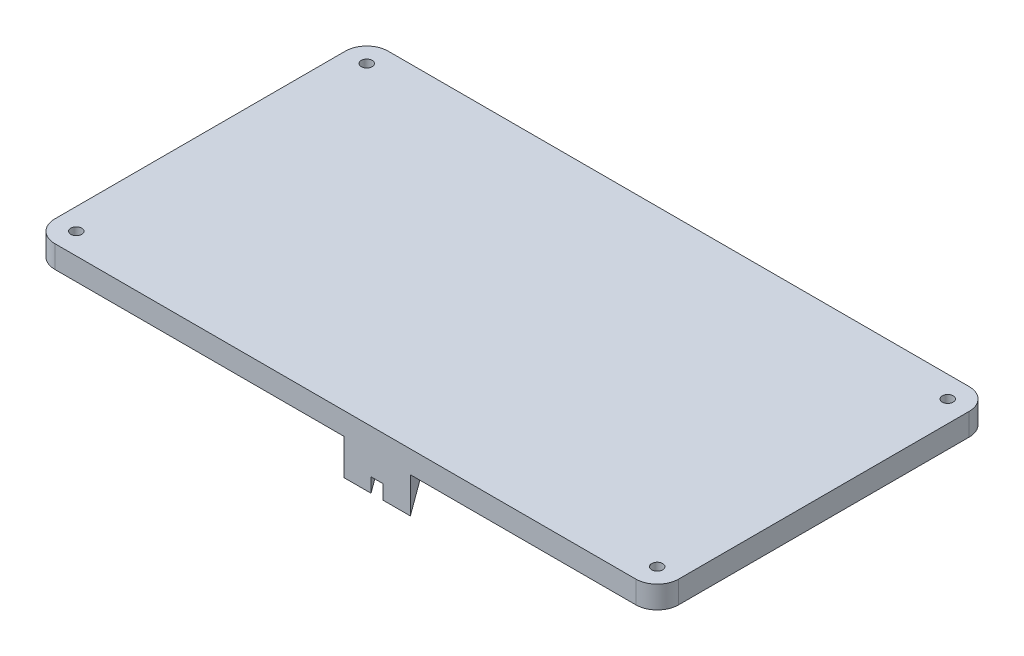
ISO-10303-21;
HEADER;
FILE_DESCRIPTION(('STEP AP214'),'2;1');
FILE_NAME('part.step','',(''),(''),'','','');
FILE_SCHEMA(('AUTOMOTIVE_DESIGN { 1 0 10303 214 1 1 1 1 }'));
ENDSEC;
DATA;
#1=APPLICATION_CONTEXT('core data for automotive mechanical design processes');
#2=APPLICATION_PROTOCOL_DEFINITION('international standard','automotive_design',2000,#1);
#3=PRODUCT_CONTEXT('',#1,'mechanical');
#4=PRODUCT('Part','Part','',(#3));
#5=PRODUCT_RELATED_PRODUCT_CATEGORY('part','',(#4));
#6=PRODUCT_DEFINITION_FORMATION('','',#4);
#7=PRODUCT_DEFINITION_CONTEXT('part definition',#1,'design');
#8=PRODUCT_DEFINITION('design','',#6,#7);
#9=PRODUCT_DEFINITION_SHAPE('','',#8);
#10=(LENGTH_UNIT() NAMED_UNIT(*) SI_UNIT(.MILLI.,.METRE.));
#11=(NAMED_UNIT(*) PLANE_ANGLE_UNIT() SI_UNIT($,.RADIAN.));
#12=(NAMED_UNIT(*) SI_UNIT($,.STERADIAN.) SOLID_ANGLE_UNIT());
#13=UNCERTAINTY_MEASURE_WITH_UNIT(LENGTH_MEASURE(1.E-05),#10,'distance_accuracy_value','');
#14=(GEOMETRIC_REPRESENTATION_CONTEXT(3) GLOBAL_UNCERTAINTY_ASSIGNED_CONTEXT((#13)) GLOBAL_UNIT_ASSIGNED_CONTEXT((#10,
#11,#12)) REPRESENTATION_CONTEXT('',''));
#15=CARTESIAN_POINT('',(0.,0.,0.));
#16=DIRECTION('',(0.,0.,1.));
#17=DIRECTION('',(1.,0.,0.));
#18=AXIS2_PLACEMENT_3D('',#15,#16,#17);
#19=CARTESIAN_POINT('',(-28.4655312881887,-13.,20.8908951783572));
#20=DIRECTION('',(0.806186520001263,0.,-0.591661469903401));
#21=DIRECTION('',(-0.591661469903401,0.,-0.806186520001263));
#22=AXIS2_PLACEMENT_3D('',#19,#20,#21);
#23=PLANE('',#22);
#24=DIRECTION('',(0.591661469903403,0.,0.806186520001261));
#25=VECTOR('',#24,1.);
#26=CARTESIAN_POINT('',(-28.4655312881888,-9.8,20.8908951783574));
#27=LINE('',#26,#25);
#28=CARTESIAN_POINT('',(-4.28278915402089,-9.8,53.8418337081482));
#29=VERTEX_POINT('',#28);
#30=CARTESIAN_POINT('',(8.47727893050485,-9.8,71.2284566459618));
#31=VERTEX_POINT('',#30);
#32=EDGE_CURVE('E61',#29,#31,#27,.T.);
#33=ORIENTED_EDGE('',*,*,#32,.F.);
#34=DIRECTION('',(0.,1.,0.));
#35=VECTOR('',#34,1.);
#36=CARTESIAN_POINT('',(-4.28278915402089,-13.,53.8418337081482));
#37=LINE('',#36,#35);
#38=CARTESIAN_POINT('',(-4.28278915402089,-13.,53.8418337081482));
#39=VERTEX_POINT('',#38);
#40=EDGE_CURVE('E219',#39,#29,#37,.T.);
#41=ORIENTED_EDGE('',*,*,#40,.F.);
#42=DIRECTION('',(-0.591661469903401,0.,-0.806186520001263));
#43=VECTOR('',#42,1.);
#44=CARTESIAN_POINT('',(-28.4655312881887,-13.,20.8908951783572));
#45=LINE('',#44,#43);
#46=CARTESIAN_POINT('',(8.47727893050485,-13.,71.2284566459618));
#47=VERTEX_POINT('',#46);
#48=EDGE_CURVE('E349',#47,#39,#45,.T.);
#49=ORIENTED_EDGE('',*,*,#48,.F.);
#50=DIRECTION('',(0.,1.,0.));
#51=VECTOR('',#50,1.);
#52=CARTESIAN_POINT('',(8.47727893050485,-13.,71.2284566459618));
#53=LINE('',#52,#51);
#54=EDGE_CURVE('E57',#47,#31,#53,.T.);
#55=ORIENTED_EDGE('',*,*,#54,.T.);
#56=EDGE_LOOP('',(#33,#41,#49,#55));
#57=FACE_BOUND('',#56,.T.);
#58=ADVANCED_FACE('F41',(#57),#23,.F.);
#59=CARTESIAN_POINT('',(24.1827421341679,-13.,32.9509385297909));
#60=DIRECTION('',(-0.591661469903402,0.,-0.806186520001263));
#61=DIRECTION('',(-0.806186520001263,0.,0.591661469903402));
#62=AXIS2_PLACEMENT_3D('',#59,#60,#61);
#63=PLANE('',#62);
#64=DIRECTION('',(-0.806186520001263,0.,0.591661469903402));
#65=VECTOR('',#64,1.);
#66=CARTESIAN_POINT('',(24.1827421341679,-9.8,32.9509385297909));
#67=LINE('',#66,#65);
#68=CARTESIAN_POINT('',(-6.05639949802451,-9.8,55.1434889419363));
#69=VERTEX_POINT('',#68);
#70=EDGE_CURVE('E223',#29,#69,#67,.T.);
#71=ORIENTED_EDGE('',*,*,#70,.T.);
#72=DIRECTION('',(0.,1.,0.));
#73=VECTOR('',#72,1.);
#74=CARTESIAN_POINT('',(-6.05639949802451,-13.,55.1434889419363));
#75=LINE('',#74,#73);
#76=CARTESIAN_POINT('',(-6.05639949802451,-13.,55.1434889419363));
#77=VERTEX_POINT('',#76);
#78=EDGE_CURVE('E208',#77,#69,#75,.T.);
#79=ORIENTED_EDGE('',*,*,#78,.F.);
#80=DIRECTION('',(-0.806186520001263,0.,0.591661469903402));
#81=VECTOR('',#80,1.);
#82=CARTESIAN_POINT('',(24.1827421341679,-13.,32.9509385297909));
#83=LINE('',#82,#81);
#84=EDGE_CURVE('E346',#39,#77,#83,.T.);
#85=ORIENTED_EDGE('',*,*,#84,.F.);
#86=ORIENTED_EDGE('',*,*,#40,.T.);
#87=EDGE_LOOP('',(#71,#79,#85,#86));
#88=FACE_BOUND('',#87,.T.);
#89=ADVANCED_FACE('F224',(#88),#63,.F.);
#90=CARTESIAN_POINT('',(-30.2391416321924,-13.,22.1925504121453));
#91=DIRECTION('',(-0.806186520001263,0.,0.591661469903401));
#92=DIRECTION('',(0.591661469903401,0.,0.806186520001263));
#93=AXIS2_PLACEMENT_3D('',#90,#91,#92);
#94=PLANE('',#93);
#95=DIRECTION('',(0.591661469903401,0.,0.806186520001263));
#96=VECTOR('',#95,1.);
#97=CARTESIAN_POINT('',(-30.2391416321924,-9.8,22.1925504121453));
#98=LINE('',#97,#96);
#99=CARTESIAN_POINT('',(5.74838190057486,-9.8,71.2284566459618));
#100=VERTEX_POINT('',#99);
#101=EDGE_CURVE('E213',#69,#100,#98,.T.);
#102=ORIENTED_EDGE('',*,*,#101,.T.);
#103=DIRECTION('',(0.,1.,0.));
#104=VECTOR('',#103,1.);
#105=CARTESIAN_POINT('',(5.74838190057486,-13.,71.2284566459618));
#106=LINE('',#105,#104);
#107=CARTESIAN_POINT('',(5.74838190057486,-13.,71.2284566459618));
#108=VERTEX_POINT('',#107);
#109=EDGE_CURVE('E220',#108,#100,#106,.T.);
#110=ORIENTED_EDGE('',*,*,#109,.F.);
#111=DIRECTION('',(0.591661469903401,0.,0.806186520001263));
#112=VECTOR('',#111,1.);
#113=CARTESIAN_POINT('',(-30.2391416321924,-13.,22.1925504121453));
#114=LINE('',#113,#112);
#115=EDGE_CURVE('E215',#77,#108,#114,.T.);
#116=ORIENTED_EDGE('',*,*,#115,.F.);
#117=ORIENTED_EDGE('',*,*,#78,.T.);
#118=EDGE_LOOP('',(#102,#110,#116,#117));
#119=FACE_BOUND('',#118,.T.);
#120=ADVANCED_FACE('F210',(#119),#94,.F.);
#121=CARTESIAN_POINT('',(6.20289003111108,-10.,18.93578833361));
#122=DIRECTION('',(-0.311298474135939,0.,-0.950312190809229));
#123=DIRECTION('',(-0.950312190809229,0.,0.311298474135939));
#124=AXIS2_PLACEMENT_3D('',#121,#122,#123);
#125=PLANE('',#124);
#126=DIRECTION('',(-0.950312190809229,0.,0.311298474135939));
#127=VECTOR('',#126,1.);
#128=CARTESIAN_POINT('',(6.20289003111108,-7.28,18.93578833361));
#129=LINE('',#128,#127);
#130=CARTESIAN_POINT('',(36.033000472315,-7.28,9.16419121693421));
#131=VERTEX_POINT('',#130);
#132=CARTESIAN_POINT('',(29.4758463557313,-7.28,11.3121506884722));
#133=VERTEX_POINT('',#132);
#134=EDGE_CURVE('E248',#131,#133,#129,.T.);
#135=ORIENTED_EDGE('',*,*,#134,.T.);
#136=DIRECTION('',(0.,1.,0.));
#137=VECTOR('',#136,1.);
#138=CARTESIAN_POINT('',(29.4758463557313,-10.,11.3121506884722));
#139=LINE('',#138,#137);
#140=CARTESIAN_POINT('',(29.4758463557313,-10.,11.3121506884722));
#141=VERTEX_POINT('',#140);
#142=EDGE_CURVE('E290',#141,#133,#139,.T.);
#143=ORIENTED_EDGE('',*,*,#142,.F.);
#144=DIRECTION('',(-0.950312190809229,0.,0.311298474135939));
#145=VECTOR('',#144,1.);
#146=CARTESIAN_POINT('',(6.20289003111108,-10.,18.93578833361));
#147=LINE('',#146,#145);
#148=CARTESIAN_POINT('',(36.033000472315,-10.,9.16419121693421));
#149=VERTEX_POINT('',#148);
#150=EDGE_CURVE('E274',#149,#141,#147,.T.);
#151=ORIENTED_EDGE('',*,*,#150,.F.);
#152=DIRECTION('',(0.,1.,0.));
#153=VECTOR('',#152,1.);
#154=CARTESIAN_POINT('',(36.033000472315,-10.,9.16419121693421));
#155=LINE('',#154,#153);
#156=EDGE_CURVE('E303',#149,#131,#155,.T.);
#157=ORIENTED_EDGE('',*,*,#156,.T.);
#158=EDGE_LOOP('',(#135,#143,#151,#157));
#159=FACE_BOUND('',#158,.T.);
#160=ADVANCED_FACE('F541',(#159),#125,.F.);
#161=CARTESIAN_POINT('',(23.2729563246203,-10.,-7.6236376451378));
#162=DIRECTION('',(-0.950312190809229,0.,0.311298474135938));
#163=DIRECTION('',(0.311298474135938,0.,0.950312190809229));
#164=AXIS2_PLACEMENT_3D('',#161,#162,#163);
#165=PLANE('',#164);
#166=DIRECTION('',(0.311298474135938,0.,0.950312190809229));
#167=VECTOR('',#166,1.);
#168=CARTESIAN_POINT('',(23.2729563246203,-7.28,-7.6236376451378));
#169=LINE('',#168,#167);
#170=CARTESIAN_POINT('',(45.1030297573554,-7.28,59.0178226670956));
#171=VERTEX_POINT('',#170);
#172=EDGE_CURVE('E252',#133,#171,#169,.T.);
#173=ORIENTED_EDGE('',*,*,#172,.T.);
#174=DIRECTION('',(0.,1.,0.));
#175=VECTOR('',#174,1.);
#176=CARTESIAN_POINT('',(45.1030297573554,-10.,59.0178226670956));
#177=LINE('',#176,#175);
#178=CARTESIAN_POINT('',(45.1030297573554,-10.,59.0178226670956));
#179=VERTEX_POINT('',#178);
#180=EDGE_CURVE('E295',#179,#171,#177,.T.);
#181=ORIENTED_EDGE('',*,*,#180,.F.);
#182=DIRECTION('',(0.311298474135938,0.,0.950312190809229));
#183=VECTOR('',#182,1.);
#184=CARTESIAN_POINT('',(23.2729563246203,-10.,-7.6236376451378));
#185=LINE('',#184,#183);
#186=EDGE_CURVE('E286',#141,#179,#185,.T.);
#187=ORIENTED_EDGE('',*,*,#186,.F.);
#188=ORIENTED_EDGE('',*,*,#142,.T.);
#189=EDGE_LOOP('',(#173,#181,#187,#188));
#190=FACE_BOUND('',#189,.T.);
#191=ADVANCED_FACE('F732',(#190),#165,.F.);
#192=CARTESIAN_POINT('',(21.8300734327352,-10.,66.6414603122333));
#193=DIRECTION('',(-0.311298474135938,0.,-0.950312190809229));
#194=DIRECTION('',(-0.950312190809229,0.,0.311298474135938));
#195=AXIS2_PLACEMENT_3D('',#192,#193,#194);
#196=PLANE('',#195);
#197=ORIENTED_EDGE('',*,*,#180,.T.);
#198=DIRECTION('',(-0.950312190809229,0.,0.311298474135938));
#199=VECTOR('',#198,1.);
#200=CARTESIAN_POINT('',(21.8300734327352,-7.28,66.6414603122333));
#201=LINE('',#200,#199);
#202=CARTESIAN_POINT('',(51.6601838739391,-7.28,56.8698631955576));
#203=VERTEX_POINT('',#202);
#204=EDGE_CURVE('E256',#203,#171,#201,.T.);
#205=ORIENTED_EDGE('',*,*,#204,.F.);
#206=DIRECTION('',(0.,1.,0.));
#207=VECTOR('',#206,1.);
#208=CARTESIAN_POINT('',(51.6601838739391,-10.,56.8698631955576));
#209=LINE('',#208,#207);
#210=CARTESIAN_POINT('',(51.6601838739391,-10.,56.8698631955576));
#211=VERTEX_POINT('',#210);
#212=EDGE_CURVE('E299',#211,#203,#209,.T.);
#213=ORIENTED_EDGE('',*,*,#212,.F.);
#214=DIRECTION('',(-0.950312190809229,0.,0.311298474135938));
#215=VECTOR('',#214,1.);
#216=CARTESIAN_POINT('',(21.8300734327352,-10.,66.6414603122333));
#217=LINE('',#216,#215);
#218=EDGE_CURVE('E282',#211,#179,#217,.T.);
#219=ORIENTED_EDGE('',*,*,#218,.T.);
#220=EDGE_LOOP('',(#197,#205,#213,#219));
#221=FACE_BOUND('',#220,.T.);
#222=ADVANCED_FACE('F740',(#221),#196,.T.);
#223=CARTESIAN_POINT('',(29.830110441204,-10.,-9.77159711667577));
#224=DIRECTION('',(-0.950312190809229,0.,0.311298474135938));
#225=DIRECTION('',(0.311298474135938,0.,0.950312190809229));
#226=AXIS2_PLACEMENT_3D('',#223,#224,#225);
#227=PLANE('',#226);
#228=ORIENTED_EDGE('',*,*,#212,.T.);
#229=DIRECTION('',(0.311298474135938,0.,0.950312190809229));
#230=VECTOR('',#229,1.);
#231=CARTESIAN_POINT('',(29.830110441204,-7.28,-9.77159711667577));
#232=LINE('',#231,#230);
#233=EDGE_CURVE('E227',#131,#203,#232,.T.);
#234=ORIENTED_EDGE('',*,*,#233,.F.);
#235=ORIENTED_EDGE('',*,*,#156,.F.);
#236=DIRECTION('',(0.311298474135938,0.,0.950312190809229));
#237=VECTOR('',#236,1.);
#238=CARTESIAN_POINT('',(29.830110441204,-10.,-9.77159711667577));
#239=LINE('',#238,#237);
#240=EDGE_CURVE('E278',#149,#211,#239,.T.);
#241=ORIENTED_EDGE('',*,*,#240,.T.);
#242=EDGE_LOOP('',(#228,#234,#235,#241));
#243=FACE_BOUND('',#242,.T.);
#244=ADVANCED_FACE('F549',(#243),#227,.T.);
#245=CARTESIAN_POINT('',(-65.,-5.,1.42845664596179));
#246=DIRECTION('',(0.,-1.,0.));
#247=DIRECTION('',(0.,0.,-1.));
#248=AXIS2_PLACEMENT_3D('',#245,#246,#247);
#249=PLANE('',#248);
#250=CARTESIAN_POINT('',(-65.,-5.,66.4284566459618));
#251=DIRECTION('',(0.,1.,0.));
#252=DIRECTION('',(0.,0.,1.));
#253=AXIS2_PLACEMENT_3D('',#250,#251,#252);
#254=CIRCLE('',#253,1.22499999999999);
#255=CARTESIAN_POINT('',(-65.,-5.,67.6534566459618));
#256=VERTEX_POINT('',#255);
#257=EDGE_CURVE('E849',#256,#256,#254,.T.);
#258=ORIENTED_EDGE('',*,*,#257,.T.);
#259=EDGE_LOOP('',(#258));
#260=FACE_BOUND('',#259,.T.);
#261=CARTESIAN_POINT('',(65.,-5.,1.42845664596179));
#262=DIRECTION('',(0.,1.,0.));
#263=DIRECTION('',(0.,0.,1.));
#264=AXIS2_PLACEMENT_3D('',#261,#262,#263);
#265=CIRCLE('',#264,1.22500000000001);
#266=CARTESIAN_POINT('',(65.,-5.,2.6534566459618));
#267=VERTEX_POINT('',#266);
#268=EDGE_CURVE('E867',#267,#267,#265,.T.);
#269=ORIENTED_EDGE('',*,*,#268,.T.);
#270=EDGE_LOOP('',(#269));
#271=FACE_BOUND('',#270,.T.);
#272=CARTESIAN_POINT('',(65.,-5.,66.4284566459618));
#273=DIRECTION('',(0.,1.,0.));
#274=DIRECTION('',(0.,0.,1.));
#275=AXIS2_PLACEMENT_3D('',#272,#273,#274);
#276=CIRCLE('',#275,1.225);
#277=CARTESIAN_POINT('',(65.,-5.,67.6534566459618));
#278=VERTEX_POINT('',#277);
#279=EDGE_CURVE('E861',#278,#278,#276,.T.);
#280=ORIENTED_EDGE('',*,*,#279,.T.);
#281=EDGE_LOOP('',(#280));
#282=FACE_BOUND('',#281,.T.);
#283=CARTESIAN_POINT('',(-65.,-5.,1.42845664596179));
#284=DIRECTION('',(0.,1.,0.));
#285=DIRECTION('',(0.,0.,1.));
#286=AXIS2_PLACEMENT_3D('',#283,#284,#285);
#287=CIRCLE('',#286,1.225);
#288=CARTESIAN_POINT('',(-65.,-5.,2.65345664596179));
#289=VERTEX_POINT('',#288);
#290=EDGE_CURVE('E234',#289,#289,#287,.T.);
#291=ORIENTED_EDGE('',*,*,#290,.T.);
#292=EDGE_LOOP('',(#291));
#293=FACE_BOUND('',#292,.T.);
#294=DIRECTION('',(-0.5916614699034,0.,-0.806186520001263));
#295=VECTOR('',#294,1.);
#296=CARTESIAN_POINT('',(-56.2622109297486,-5.,-4.98421957318746));
#297=LINE('',#296,#295);
#298=CARTESIAN_POINT('',(-0.329616029720897,-5.,71.2284566459618));
#299=VERTEX_POINT('',#298);
#300=CARTESIAN_POINT('',(-10.3583824006555,-5.,57.5634528021092));
#301=VERTEX_POINT('',#300);
#302=EDGE_CURVE('E398',#299,#301,#297,.T.);
#303=ORIENTED_EDGE('',*,*,#302,.F.);
#304=DIRECTION('',(1.,0.,0.));
#305=VECTOR('',#304,1.);
#306=CARTESIAN_POINT('',(-65.,-5.,71.2284566459618));
#307=LINE('',#306,#305);
#308=CARTESIAN_POINT('',(-65.,-5.,71.2284566459618));
#309=VERTEX_POINT('',#308);
#310=EDGE_CURVE('E421',#309,#299,#307,.T.);
#311=ORIENTED_EDGE('',*,*,#310,.F.);
#312=CARTESIAN_POINT('',(-65.,-5.,66.4284566459618));
#313=DIRECTION('',(0.,-1.,0.));
#314=DIRECTION('',(0.,0.,-1.));
#315=AXIS2_PLACEMENT_3D('',#312,#313,#314);
#316=CIRCLE('',#315,4.80000000000001);
#317=CARTESIAN_POINT('',(-69.8,-5.,66.4284566459618));
#318=VERTEX_POINT('',#317);
#319=EDGE_CURVE('E425',#309,#318,#316,.T.);
#320=ORIENTED_EDGE('',*,*,#319,.T.);
#321=DIRECTION('',(0.,0.,1.));
#322=VECTOR('',#321,1.);
#323=CARTESIAN_POINT('',(-69.8,-5.,1.42845664596179));
#324=LINE('',#323,#322);
#325=CARTESIAN_POINT('',(-69.8,-5.,1.42845664596179));
#326=VERTEX_POINT('',#325);
#327=EDGE_CURVE('E428',#326,#318,#324,.T.);
#328=ORIENTED_EDGE('',*,*,#327,.F.);
#329=CARTESIAN_POINT('',(-65.,-5.,1.42845664596179));
#330=DIRECTION('',(0.,-1.,0.));
#331=DIRECTION('',(0.,0.,-1.));
#332=AXIS2_PLACEMENT_3D('',#329,#330,#331);
#333=CIRCLE('',#332,4.8);
#334=CARTESIAN_POINT('',(-65.,-5.,-3.37154335403821));
#335=VERTEX_POINT('',#334);
#336=EDGE_CURVE('E402',#326,#335,#333,.T.);
#337=ORIENTED_EDGE('',*,*,#336,.T.);
#338=DIRECTION('',(1.,0.,0.));
#339=VECTOR('',#338,1.);
#340=CARTESIAN_POINT('',(-65.,-5.,-3.37154335403821));
#341=LINE('',#340,#339);
#342=CARTESIAN_POINT('',(65.,-5.,-3.37154335403821));
#343=VERTEX_POINT('',#342);
#344=EDGE_CURVE('E406',#335,#343,#341,.T.);
#345=ORIENTED_EDGE('',*,*,#344,.T.);
#346=CARTESIAN_POINT('',(65.,-5.,1.42845664596179));
#347=DIRECTION('',(0.,-1.,0.));
#348=DIRECTION('',(0.,0.,-1.));
#349=AXIS2_PLACEMENT_3D('',#346,#347,#348);
#350=CIRCLE('',#349,4.8);
#351=CARTESIAN_POINT('',(69.8,-5.,1.42845664596179));
#352=VERTEX_POINT('',#351);
#353=EDGE_CURVE('E410',#343,#352,#350,.T.);
#354=ORIENTED_EDGE('',*,*,#353,.T.);
#355=DIRECTION('',(0.,0.,1.));
#356=VECTOR('',#355,1.);
#357=CARTESIAN_POINT('',(69.8,-5.,1.42845664596179));
#358=LINE('',#357,#356);
#359=CARTESIAN_POINT('',(69.8,-5.,66.4284566459618));
#360=VERTEX_POINT('',#359);
#361=EDGE_CURVE('E413',#352,#360,#358,.T.);
#362=ORIENTED_EDGE('',*,*,#361,.T.);
#363=CARTESIAN_POINT('',(65.,-5.,66.4284566459618));
#364=DIRECTION('',(0.,1.,0.));
#365=DIRECTION('',(0.,0.,1.));
#366=AXIS2_PLACEMENT_3D('',#363,#364,#365);
#367=CIRCLE('',#366,4.79999999999999);
#368=CARTESIAN_POINT('',(65.,-5.,71.2284566459618));
#369=VERTEX_POINT('',#368);
#370=EDGE_CURVE('E416',#369,#360,#367,.T.);
#371=ORIENTED_EDGE('',*,*,#370,.F.);
#372=CARTESIAN_POINT('',(14.5552768608006,-5.,71.2284566459618));
#373=VERTEX_POINT('',#372);
#374=EDGE_CURVE('E420',#373,#369,#307,.T.);
#375=ORIENTED_EDGE('',*,*,#374,.F.);
#376=DIRECTION('',(-0.591661469903365,0.,-0.80618652000129));
#377=VECTOR('',#376,1.);
#378=CARTESIAN_POINT('',(-46.5879726897283,-5.,-12.0841572120308));
#379=LINE('',#378,#377);
#380=CARTESIAN_POINT('',(-3.23161640854136,-5.,46.9923785576153));
#381=VERTEX_POINT('',#380);
#382=EDGE_CURVE('E368',#373,#381,#379,.T.);
#383=ORIENTED_EDGE('',*,*,#382,.T.);
#384=DIRECTION('',(0.806186520001264,0.,-0.591661469903399));
#385=VECTOR('',#384,1.);
#386=CARTESIAN_POINT('',(-21.6436437188088,-5.,60.504992415606));
#387=LINE('',#386,#385);
#388=CARTESIAN_POINT('',(-10.3583824006555,-5.,52.2227225759514));
#389=VERTEX_POINT('',#388);
#390=EDGE_CURVE('E392',#389,#381,#387,.T.);
#391=ORIENTED_EDGE('',*,*,#390,.F.);
#392=DIRECTION('',(0.,0.,-1.));
#393=VECTOR('',#392,1.);
#394=CARTESIAN_POINT('',(-10.3583824006554,-5.,1.42845664596179));
#395=LINE('',#394,#393);
#396=EDGE_CURVE('E395',#301,#389,#395,.T.);
#397=ORIENTED_EDGE('',*,*,#396,.F.);
#398=EDGE_LOOP('',(#303,#311,#320,#328,#337,#345,#354,#362,#371,#375,#383,#391,#397));
#399=FACE_BOUND('',#398,.T.);
#400=DIRECTION('',(0.95031219080923,0.,-0.311298474135935));
#401=VECTOR('',#400,1.);
#402=CARTESIAN_POINT('',(-35.768207323462,-5.,90.665414895849));
#403=LINE('',#402,#401);
#404=CARTESIAN_POINT('',(41.9718625456563,-5.,65.1997149253268));
#405=VERTEX_POINT('',#404);
#406=CARTESIAN_POINT('',(57.8420761321704,-5.,60.0010304072567));
#407=VERTEX_POINT('',#406);
#408=EDGE_CURVE('E329',#405,#407,#403,.T.);
#409=ORIENTED_EDGE('',*,*,#408,.T.);
#410=DIRECTION('',(-0.311298474135938,0.,-0.950312190809229));
#411=VECTOR('',#410,1.);
#412=CARTESIAN_POINT('',(28.6102834556321,-5.,-29.2359278426307));
#413=LINE('',#412,#411);
#414=CARTESIAN_POINT('',(39.1641676840142,-5.,2.98229895870288));
#415=VERTEX_POINT('',#414);
#416=EDGE_CURVE('E332',#407,#415,#413,.T.);
#417=ORIENTED_EDGE('',*,*,#416,.T.);
#418=DIRECTION('',(0.950312190809229,0.,-0.311298474135939));
#419=VECTOR('',#418,1.);
#420=CARTESIAN_POINT('',(-54.4461157716179,-5.,33.6466834472955));
#421=LINE('',#420,#419);
#422=CARTESIAN_POINT('',(23.2939540975,-5.,8.18098347677305));
#423=VERTEX_POINT('',#422);
#424=EDGE_CURVE('E294',#423,#415,#421,.T.);
#425=ORIENTED_EDGE('',*,*,#424,.F.);
#426=DIRECTION('',(-0.311298474135938,0.,-0.950312190809229));
#427=VECTOR('',#426,1.);
#428=CARTESIAN_POINT('',(12.740069869118,-5.,-24.0372433245606));
#429=LINE('',#428,#427);
#430=EDGE_CURVE('E325',#405,#423,#429,.T.);
#431=ORIENTED_EDGE('',*,*,#430,.F.);
#432=EDGE_LOOP('',(#409,#417,#425,#431));
#433=FACE_BOUND('',#432,.T.);
#434=ADVANCED_FACE('F499',(#260,#271,#282,#293,#399,#433),#249,.T.);
#435=CARTESIAN_POINT('',(-65.,-5.,1.42845664596179));
#436=DIRECTION('',(0.,1.,0.));
#437=DIRECTION('',(0.,0.,1.));
#438=AXIS2_PLACEMENT_3D('',#435,#436,#437);
#439=CYLINDRICAL_SURFACE('',#438,4.8);
#440=CARTESIAN_POINT('',(-65.,0.,1.42845664596179));
#441=DIRECTION('',(0.,-1.,0.));
#442=DIRECTION('',(0.,0.,-1.));
#443=AXIS2_PLACEMENT_3D('',#440,#441,#442);
#444=CIRCLE('',#443,4.8);
#445=CARTESIAN_POINT('',(-69.8,0.,1.42845664596179));
#446=VERTEX_POINT('',#445);
#447=CARTESIAN_POINT('',(-65.,0.,-3.37154335403821));
#448=VERTEX_POINT('',#447);
#449=EDGE_CURVE('E401',#446,#448,#444,.T.);
#450=ORIENTED_EDGE('',*,*,#449,.T.);
#451=DIRECTION('',(0.,1.,0.));
#452=VECTOR('',#451,1.);
#453=CARTESIAN_POINT('',(-65.,-5.,-3.37154335403821));
#454=LINE('',#453,#452);
#455=EDGE_CURVE('E11',#335,#448,#454,.T.);
#456=ORIENTED_EDGE('',*,*,#455,.F.);
#457=ORIENTED_EDGE('',*,*,#336,.F.);
#458=DIRECTION('',(0.,1.,0.));
#459=VECTOR('',#458,1.);
#460=CARTESIAN_POINT('',(-69.8,-5.,1.42845664596179));
#461=LINE('',#460,#459);
#462=EDGE_CURVE('E432',#326,#446,#461,.T.);
#463=ORIENTED_EDGE('',*,*,#462,.T.);
#464=EDGE_LOOP('',(#450,#456,#457,#463));
#465=FACE_BOUND('',#464,.T.);
#466=ADVANCED_FACE('F43',(#465),#439,.T.);
#467=CARTESIAN_POINT('',(-65.,-5.,-3.37154335403821));
#468=DIRECTION('',(0.,0.,1.));
#469=DIRECTION('',(1.,0.,0.));
#470=AXIS2_PLACEMENT_3D('',#467,#468,#469);
#471=PLANE('',#470);
#472=DIRECTION('',(1.,0.,0.));
#473=VECTOR('',#472,1.);
#474=CARTESIAN_POINT('',(-65.,0.,-3.37154335403821));
#475=LINE('',#474,#473);
#476=CARTESIAN_POINT('',(65.,0.,-3.37154335403821));
#477=VERTEX_POINT('',#476);
#478=EDGE_CURVE('E436',#448,#477,#475,.T.);
#479=ORIENTED_EDGE('',*,*,#478,.T.);
#480=DIRECTION('',(0.,1.,0.));
#481=VECTOR('',#480,1.);
#482=CARTESIAN_POINT('',(65.,-5.,-3.37154335403821));
#483=LINE('',#482,#481);
#484=EDGE_CURVE('E50',#343,#477,#483,.T.);
#485=ORIENTED_EDGE('',*,*,#484,.F.);
#486=ORIENTED_EDGE('',*,*,#344,.F.);
#487=ORIENTED_EDGE('',*,*,#455,.T.);
#488=EDGE_LOOP('',(#479,#485,#486,#487));
#489=FACE_BOUND('',#488,.T.);
#490=ADVANCED_FACE('F505',(#489),#471,.F.);
#491=CARTESIAN_POINT('',(65.,-5.,1.42845664596179));
#492=DIRECTION('',(0.,1.,0.));
#493=DIRECTION('',(0.,0.,1.));
#494=AXIS2_PLACEMENT_3D('',#491,#492,#493);
#495=CYLINDRICAL_SURFACE('',#494,4.8);
#496=CARTESIAN_POINT('',(65.,0.,1.42845664596179));
#497=DIRECTION('',(0.,-1.,0.));
#498=DIRECTION('',(0.,0.,-1.));
#499=AXIS2_PLACEMENT_3D('',#496,#497,#498);
#500=CIRCLE('',#499,4.8);
#501=CARTESIAN_POINT('',(69.8,0.,1.42845664596179));
#502=VERTEX_POINT('',#501);
#503=EDGE_CURVE('E439',#477,#502,#500,.T.);
#504=ORIENTED_EDGE('',*,*,#503,.T.);
#505=DIRECTION('',(0.,1.,0.));
#506=VECTOR('',#505,1.);
#507=CARTESIAN_POINT('',(69.8,-5.,1.42845664596179));
#508=LINE('',#507,#506);
#509=EDGE_CURVE('E475',#352,#502,#508,.T.);
#510=ORIENTED_EDGE('',*,*,#509,.F.);
#511=ORIENTED_EDGE('',*,*,#353,.F.);
#512=ORIENTED_EDGE('',*,*,#484,.T.);
#513=EDGE_LOOP('',(#504,#510,#511,#512));
#514=FACE_BOUND('',#513,.T.);
#515=ADVANCED_FACE('F484',(#514),#495,.T.);
#516=CARTESIAN_POINT('',(69.8,-5.,1.42845664596179));
#517=DIRECTION('',(-1.,0.,0.));
#518=DIRECTION('',(0.,0.,1.));
#519=AXIS2_PLACEMENT_3D('',#516,#517,#518);
#520=PLANE('',#519);
#521=DIRECTION('',(0.,0.,1.));
#522=VECTOR('',#521,1.);
#523=CARTESIAN_POINT('',(69.8,0.,1.42845664596179));
#524=LINE('',#523,#522);
#525=CARTESIAN_POINT('',(69.8,0.,66.4284566459618));
#526=VERTEX_POINT('',#525);
#527=EDGE_CURVE('E442',#502,#526,#524,.T.);
#528=ORIENTED_EDGE('',*,*,#527,.T.);
#529=DIRECTION('',(0.,1.,0.));
#530=VECTOR('',#529,1.);
#531=CARTESIAN_POINT('',(69.8,-5.,66.4284566459618));
#532=LINE('',#531,#530);
#533=EDGE_CURVE('E472',#360,#526,#532,.T.);
#534=ORIENTED_EDGE('',*,*,#533,.F.);
#535=ORIENTED_EDGE('',*,*,#361,.F.);
#536=ORIENTED_EDGE('',*,*,#509,.T.);
#537=EDGE_LOOP('',(#528,#534,#535,#536));
#538=FACE_BOUND('',#537,.T.);
#539=ADVANCED_FACE('F494',(#538),#520,.F.);
#540=CARTESIAN_POINT('',(65.,-5.,66.4284566459618));
#541=DIRECTION('',(0.,1.,0.));
#542=DIRECTION('',(0.,0.,1.));
#543=AXIS2_PLACEMENT_3D('',#540,#541,#542);
#544=CYLINDRICAL_SURFACE('',#543,4.79999999999999);
#545=CARTESIAN_POINT('',(65.,0.,66.4284566459618));
#546=DIRECTION('',(0.,1.,0.));
#547=DIRECTION('',(0.,0.,1.));
#548=AXIS2_PLACEMENT_3D('',#545,#546,#547);
#549=CIRCLE('',#548,4.79999999999999);
#550=CARTESIAN_POINT('',(65.,0.,71.2284566459618));
#551=VERTEX_POINT('',#550);
#552=EDGE_CURVE('E446',#551,#526,#549,.T.);
#553=ORIENTED_EDGE('',*,*,#552,.F.);
#554=DIRECTION('',(0.,1.,0.));
#555=VECTOR('',#554,1.);
#556=CARTESIAN_POINT('',(65.,-5.,71.2284566459618));
#557=LINE('',#556,#555);
#558=EDGE_CURVE('E468',#369,#551,#557,.T.);
#559=ORIENTED_EDGE('',*,*,#558,.F.);
#560=ORIENTED_EDGE('',*,*,#370,.T.);
#561=ORIENTED_EDGE('',*,*,#533,.T.);
#562=EDGE_LOOP('',(#553,#559,#560,#561));
#563=FACE_BOUND('',#562,.T.);
#564=ADVANCED_FACE('F520',(#563),#544,.T.);
#565=CARTESIAN_POINT('',(-65.,-5.,71.2284566459618));
#566=DIRECTION('',(0.,0.,1.));
#567=DIRECTION('',(1.,0.,0.));
#568=AXIS2_PLACEMENT_3D('',#565,#566,#567);
#569=PLANE('',#568);
#570=ORIENTED_EDGE('',*,*,#558,.T.);
#571=DIRECTION('',(1.,0.,0.));
#572=VECTOR('',#571,1.);
#573=CARTESIAN_POINT('',(-65.,0.,71.2284566459618));
#574=LINE('',#573,#572);
#575=CARTESIAN_POINT('',(-65.,0.,71.2284566459618));
#576=VERTEX_POINT('',#575);
#577=EDGE_CURVE('E450',#576,#551,#574,.T.);
#578=ORIENTED_EDGE('',*,*,#577,.F.);
#579=DIRECTION('',(0.,1.,0.));
#580=VECTOR('',#579,1.);
#581=CARTESIAN_POINT('',(-65.,-5.,71.2284566459618));
#582=LINE('',#581,#580);
#583=EDGE_CURVE('E465',#309,#576,#582,.T.);
#584=ORIENTED_EDGE('',*,*,#583,.F.);
#585=ORIENTED_EDGE('',*,*,#310,.T.);
#586=DIRECTION('',(0.,1.,0.));
#587=VECTOR('',#586,1.);
#588=CARTESIAN_POINT('',(-0.329616029720897,-13.,71.2284566459618));
#589=LINE('',#588,#587);
#590=CARTESIAN_POINT('',(-0.329616029720897,-13.,71.2284566459618));
#591=VERTEX_POINT('',#590);
#592=EDGE_CURVE('E363',#591,#299,#589,.T.);
#593=ORIENTED_EDGE('',*,*,#592,.F.);
#594=DIRECTION('',(1.,0.,0.));
#595=VECTOR('',#594,1.);
#596=CARTESIAN_POINT('',(0.,-13.,71.2284566459618));
#597=LINE('',#596,#595);
#598=EDGE_CURVE('E339',#591,#108,#597,.T.);
#599=ORIENTED_EDGE('',*,*,#598,.T.);
#600=ORIENTED_EDGE('',*,*,#109,.T.);
#601=DIRECTION('',(1.,0.,0.));
#602=VECTOR('',#601,1.);
#603=CARTESIAN_POINT('',(0.,-9.8,71.2284566459618));
#604=LINE('',#603,#602);
#605=EDGE_CURVE('E232',#100,#31,#604,.T.);
#606=ORIENTED_EDGE('',*,*,#605,.T.);
#607=ORIENTED_EDGE('',*,*,#54,.F.);
#608=CARTESIAN_POINT('',(14.5552768608006,-13.,71.2284566459618));
#609=VERTEX_POINT('',#608);
#610=EDGE_CURVE('E343',#47,#609,#597,.T.);
#611=ORIENTED_EDGE('',*,*,#610,.T.);
#612=DIRECTION('',(0.,1.,0.));
#613=VECTOR('',#612,1.);
#614=CARTESIAN_POINT('',(14.5552768608006,-13.,71.2284566459618));
#615=LINE('',#614,#613);
#616=EDGE_CURVE('E377',#609,#373,#615,.T.);
#617=ORIENTED_EDGE('',*,*,#616,.T.);
#618=ORIENTED_EDGE('',*,*,#374,.T.);
#619=EDGE_LOOP('',(#570,#578,#584,#585,#593,#599,#600,#606,#607,#611,#617,#618));
#620=FACE_BOUND('',#619,.T.);
#621=ADVANCED_FACE('F517',(#620),#569,.T.);
#622=CARTESIAN_POINT('',(-65.,-5.,66.4284566459618));
#623=DIRECTION('',(0.,1.,0.));
#624=DIRECTION('',(0.,0.,1.));
#625=AXIS2_PLACEMENT_3D('',#622,#623,#624);
#626=CYLINDRICAL_SURFACE('',#625,4.80000000000001);
#627=CARTESIAN_POINT('',(-65.,0.,66.4284566459618));
#628=DIRECTION('',(0.,-1.,0.));
#629=DIRECTION('',(0.,0.,-1.));
#630=AXIS2_PLACEMENT_3D('',#627,#628,#629);
#631=CIRCLE('',#630,4.80000000000001);
#632=CARTESIAN_POINT('',(-69.8,0.,66.4284566459618));
#633=VERTEX_POINT('',#632);
#634=EDGE_CURVE('E453',#576,#633,#631,.T.);
#635=ORIENTED_EDGE('',*,*,#634,.T.);
#636=DIRECTION('',(0.,1.,0.));
#637=VECTOR('',#636,1.);
#638=CARTESIAN_POINT('',(-69.8,-5.,66.4284566459618));
#639=LINE('',#638,#637);
#640=EDGE_CURVE('E462',#318,#633,#639,.T.);
#641=ORIENTED_EDGE('',*,*,#640,.F.);
#642=ORIENTED_EDGE('',*,*,#319,.F.);
#643=ORIENTED_EDGE('',*,*,#583,.T.);
#644=EDGE_LOOP('',(#635,#641,#642,#643));
#645=FACE_BOUND('',#644,.T.);
#646=ADVANCED_FACE('F514',(#645),#626,.T.);
#647=CARTESIAN_POINT('',(-69.8,-5.,1.42845664596179));
#648=DIRECTION('',(-1.,0.,0.));
#649=DIRECTION('',(0.,0.,1.));
#650=AXIS2_PLACEMENT_3D('',#647,#648,#649);
#651=PLANE('',#650);
#652=DIRECTION('',(0.,0.,1.));
#653=VECTOR('',#652,1.);
#654=CARTESIAN_POINT('',(-69.8,0.,1.42845664596179));
#655=LINE('',#654,#653);
#656=EDGE_CURVE('E407',#446,#633,#655,.T.);
#657=ORIENTED_EDGE('',*,*,#656,.F.);
#658=ORIENTED_EDGE('',*,*,#462,.F.);
#659=ORIENTED_EDGE('',*,*,#327,.T.);
#660=ORIENTED_EDGE('',*,*,#640,.T.);
#661=EDGE_LOOP('',(#657,#658,#659,#660));
#662=FACE_BOUND('',#661,.T.);
#663=ADVANCED_FACE('F510',(#662),#651,.T.);
#664=CARTESIAN_POINT('',(-65.,0.,1.42845664596179));
#665=DIRECTION('',(0.,-1.,0.));
#666=DIRECTION('',(0.,0.,-1.));
#667=AXIS2_PLACEMENT_3D('',#664,#665,#666);
#668=PLANE('',#667);
#669=CARTESIAN_POINT('',(-65.,0.,66.4284566459618));
#670=DIRECTION('',(0.,1.,0.));
#671=DIRECTION('',(0.,0.,1.));
#672=AXIS2_PLACEMENT_3D('',#669,#670,#671);
#673=CIRCLE('',#672,1.22499999999999);
#674=CARTESIAN_POINT('',(-65.,0.,67.6534566459618));
#675=VERTEX_POINT('',#674);
#676=EDGE_CURVE('E852',#675,#675,#673,.T.);
#677=ORIENTED_EDGE('',*,*,#676,.F.);
#678=EDGE_LOOP('',(#677));
#679=FACE_BOUND('',#678,.T.);
#680=CARTESIAN_POINT('',(65.,0.,1.42845664596179));
#681=DIRECTION('',(0.,1.,0.));
#682=DIRECTION('',(0.,0.,1.));
#683=AXIS2_PLACEMENT_3D('',#680,#681,#682);
#684=CIRCLE('',#683,1.22500000000001);
#685=CARTESIAN_POINT('',(65.,0.,2.6534566459618));
#686=VERTEX_POINT('',#685);
#687=EDGE_CURVE('E858',#686,#686,#684,.T.);
#688=ORIENTED_EDGE('',*,*,#687,.F.);
#689=EDGE_LOOP('',(#688));
#690=FACE_BOUND('',#689,.T.);
#691=CARTESIAN_POINT('',(65.,0.,66.4284566459618));
#692=DIRECTION('',(0.,1.,0.));
#693=DIRECTION('',(0.,0.,1.));
#694=AXIS2_PLACEMENT_3D('',#691,#692,#693);
#695=CIRCLE('',#694,1.225);
#696=CARTESIAN_POINT('',(65.,0.,67.6534566459618));
#697=VERTEX_POINT('',#696);
#698=EDGE_CURVE('E870',#697,#697,#695,.T.);
#699=ORIENTED_EDGE('',*,*,#698,.F.);
#700=EDGE_LOOP('',(#699));
#701=FACE_BOUND('',#700,.T.);
#702=CARTESIAN_POINT('',(-65.,0.,1.42845664596179));
#703=DIRECTION('',(0.,1.,0.));
#704=DIRECTION('',(0.,0.,1.));
#705=AXIS2_PLACEMENT_3D('',#702,#703,#704);
#706=CIRCLE('',#705,1.225);
#707=CARTESIAN_POINT('',(-65.,0.,2.65345664596179));
#708=VERTEX_POINT('',#707);
#709=EDGE_CURVE('E240',#708,#708,#706,.T.);
#710=ORIENTED_EDGE('',*,*,#709,.F.);
#711=EDGE_LOOP('',(#710));
#712=FACE_BOUND('',#711,.T.);
#713=ORIENTED_EDGE('',*,*,#577,.T.);
#714=ORIENTED_EDGE('',*,*,#552,.T.);
#715=ORIENTED_EDGE('',*,*,#527,.F.);
#716=ORIENTED_EDGE('',*,*,#503,.F.);
#717=ORIENTED_EDGE('',*,*,#478,.F.);
#718=ORIENTED_EDGE('',*,*,#449,.F.);
#719=ORIENTED_EDGE('',*,*,#656,.T.);
#720=ORIENTED_EDGE('',*,*,#634,.F.);
#721=EDGE_LOOP('',(#713,#714,#715,#716,#717,#718,#719,#720));
#722=FACE_BOUND('',#721,.T.);
#723=ADVANCED_FACE('F489',(#679,#690,#701,#712,#722),#668,.F.);
#724=CARTESIAN_POINT('',(-34.1894555801986,-13.,25.091691614672));
#725=DIRECTION('',(-0.806186520001263,0.,0.5916614699034));
#726=DIRECTION('',(0.5916614699034,0.,0.806186520001263));
#727=AXIS2_PLACEMENT_3D('',#724,#725,#726);
#728=PLANE('',#727);
#729=ORIENTED_EDGE('',*,*,#592,.T.);
#730=ORIENTED_EDGE('',*,*,#302,.T.);
#731=DIRECTION('',(0.,1.,0.));
#732=VECTOR('',#731,1.);
#733=CARTESIAN_POINT('',(-10.3583824006555,-13.,57.5634528021092));
#734=LINE('',#733,#732);
#735=CARTESIAN_POINT('',(-10.3583824006555,-13.,57.5634528021092));
#736=VERTEX_POINT('',#735);
#737=EDGE_CURVE('E364',#736,#301,#734,.T.);
#738=ORIENTED_EDGE('',*,*,#737,.F.);
#739=DIRECTION('',(0.5916614699034,0.,0.806186520001264));
#740=VECTOR('',#739,1.);
#741=CARTESIAN_POINT('',(-34.1894555801986,-13.,25.091691614672));
#742=LINE('',#741,#740);
#743=EDGE_CURVE('E335',#736,#591,#742,.T.);
#744=ORIENTED_EDGE('',*,*,#743,.T.);
#745=EDGE_LOOP('',(#729,#730,#738,#744));
#746=FACE_BOUND('',#745,.T.);
#747=ADVANCED_FACE('F542',(#746),#728,.T.);
#748=CARTESIAN_POINT('',(-10.3583824006554,-13.,0.));
#749=DIRECTION('',(-1.,0.,0.));
#750=DIRECTION('',(0.,0.,1.));
#751=AXIS2_PLACEMENT_3D('',#748,#749,#750);
#752=PLANE('',#751);
#753=ORIENTED_EDGE('',*,*,#737,.T.);
#754=ORIENTED_EDGE('',*,*,#396,.T.);
#755=DIRECTION('',(0.,1.,0.));
#756=VECTOR('',#755,1.);
#757=CARTESIAN_POINT('',(-10.3583824006555,-13.,52.2227225759514));
#758=LINE('',#757,#756);
#759=CARTESIAN_POINT('',(-10.3583824006555,-13.,52.2227225759514));
#760=VERTEX_POINT('',#759);
#761=EDGE_CURVE('E369',#760,#389,#758,.T.);
#762=ORIENTED_EDGE('',*,*,#761,.F.);
#763=DIRECTION('',(0.,0.,1.));
#764=VECTOR('',#763,1.);
#765=CARTESIAN_POINT('',(-10.3583824006554,-13.,0.));
#766=LINE('',#765,#764);
#767=EDGE_CURVE('E359',#760,#736,#766,.T.);
#768=ORIENTED_EDGE('',*,*,#767,.T.);
#769=EDGE_LOOP('',(#753,#754,#762,#768));
#770=FACE_BOUND('',#769,.T.);
#771=ADVANCED_FACE('F545',(#770),#752,.T.);
#772=CARTESIAN_POINT('',(21.2836009316412,-13.,29.0006245817848));
#773=DIRECTION('',(-0.591661469903399,0.,-0.806186520001264));
#774=DIRECTION('',(-0.806186520001264,0.,0.591661469903399));
#775=AXIS2_PLACEMENT_3D('',#772,#773,#774);
#776=PLANE('',#775);
#777=ORIENTED_EDGE('',*,*,#761,.T.);
#778=ORIENTED_EDGE('',*,*,#390,.T.);
#779=DIRECTION('',(0.,1.,0.));
#780=VECTOR('',#779,1.);
#781=CARTESIAN_POINT('',(-3.23161640854136,-13.,46.9923785576153));
#782=LINE('',#781,#780);
#783=CARTESIAN_POINT('',(-3.23161640854136,-13.,46.9923785576153));
#784=VERTEX_POINT('',#783);
#785=EDGE_CURVE('E373',#784,#381,#782,.T.);
#786=ORIENTED_EDGE('',*,*,#785,.F.);
#787=DIRECTION('',(-0.806186520001264,0.,0.591661469903399));
#788=VECTOR('',#787,1.);
#789=CARTESIAN_POINT('',(21.2836009316412,-13.,29.0006245817848));
#790=LINE('',#789,#788);
#791=EDGE_CURVE('E355',#784,#760,#790,.T.);
#792=ORIENTED_EDGE('',*,*,#791,.T.);
#793=EDGE_LOOP('',(#777,#778,#786,#792));
#794=FACE_BOUND('',#793,.T.);
#795=ADVANCED_FACE('F581',(#794),#776,.T.);
#796=CARTESIAN_POINT('',(-24.515217340181,-13.,17.9917539758277));
#797=DIRECTION('',(-0.80618652000129,0.,0.591661469903365));
#798=DIRECTION('',(0.591661469903365,0.,0.80618652000129));
#799=AXIS2_PLACEMENT_3D('',#796,#797,#798);
#800=PLANE('',#799);
#801=ORIENTED_EDGE('',*,*,#382,.F.);
#802=ORIENTED_EDGE('',*,*,#616,.F.);
#803=DIRECTION('',(0.591661469903365,0.,0.80618652000129));
#804=VECTOR('',#803,1.);
#805=CARTESIAN_POINT('',(-24.515217340181,-13.,17.9917539758277));
#806=LINE('',#805,#804);
#807=EDGE_CURVE('E352',#784,#609,#806,.T.);
#808=ORIENTED_EDGE('',*,*,#807,.F.);
#809=ORIENTED_EDGE('',*,*,#785,.T.);
#810=EDGE_LOOP('',(#801,#802,#808,#809));
#811=FACE_BOUND('',#810,.T.);
#812=ADVANCED_FACE('F536',(#811),#800,.F.);
#813=CARTESIAN_POINT('',(0.,-13.,0.));
#814=DIRECTION('',(0.,1.,0.));
#815=DIRECTION('',(0.,0.,1.));
#816=AXIS2_PLACEMENT_3D('',#813,#814,#815);
#817=PLANE('',#816);
#818=ORIENTED_EDGE('',*,*,#743,.F.);
#819=ORIENTED_EDGE('',*,*,#767,.F.);
#820=ORIENTED_EDGE('',*,*,#791,.F.);
#821=ORIENTED_EDGE('',*,*,#807,.T.);
#822=ORIENTED_EDGE('',*,*,#610,.F.);
#823=ORIENTED_EDGE('',*,*,#48,.T.);
#824=ORIENTED_EDGE('',*,*,#84,.T.);
#825=ORIENTED_EDGE('',*,*,#115,.T.);
#826=ORIENTED_EDGE('',*,*,#598,.F.);
#827=EDGE_LOOP('',(#818,#819,#820,#821,#822,#823,#824,#825,#826));
#828=FACE_BOUND('',#827,.T.);
#829=ADVANCED_FACE('F595',(#828),#817,.F.);
#830=CARTESIAN_POINT('',(34.4866401761692,-10.,-11.2969596399419));
#831=DIRECTION('',(-0.950312190809229,0.,0.311298474135938));
#832=DIRECTION('',(0.311298474135938,0.,0.950312190809229));
#833=AXIS2_PLACEMENT_3D('',#830,#831,#832);
#834=PLANE('',#833);
#835=ORIENTED_EDGE('',*,*,#416,.F.);
#836=DIRECTION('',(0.,1.,0.));
#837=VECTOR('',#836,1.);
#838=CARTESIAN_POINT('',(57.8420761321704,-10.,60.0010304072567));
#839=LINE('',#838,#837);
#840=CARTESIAN_POINT('',(57.8420761321704,-10.,60.0010304072567));
#841=VERTEX_POINT('',#840);
#842=EDGE_CURVE('E307',#841,#407,#839,.T.);
#843=ORIENTED_EDGE('',*,*,#842,.F.);
#844=DIRECTION('',(0.311298474135938,0.,0.950312190809229));
#845=VECTOR('',#844,1.);
#846=CARTESIAN_POINT('',(34.4866401761692,-10.,-11.2969596399419));
#847=LINE('',#846,#845);
#848=CARTESIAN_POINT('',(39.1641676840142,-10.,2.98229895870288));
#849=VERTEX_POINT('',#848);
#850=EDGE_CURVE('E259',#849,#841,#847,.T.);
#851=ORIENTED_EDGE('',*,*,#850,.F.);
#852=DIRECTION('',(0.,1.,0.));
#853=VECTOR('',#852,1.);
#854=CARTESIAN_POINT('',(39.1641676840142,-10.,2.98229895870288));
#855=LINE('',#854,#853);
#856=EDGE_CURVE('E289',#849,#415,#855,.T.);
#857=ORIENTED_EDGE('',*,*,#856,.T.);
#858=EDGE_LOOP('',(#835,#843,#851,#857));
#859=FACE_BOUND('',#858,.T.);
#860=ADVANCED_FACE('F602',(#859),#834,.F.);
#861=CARTESIAN_POINT('',(23.355435956001,-10.,71.2979900471985));
#862=DIRECTION('',(-0.311298474135935,0.,-0.95031219080923));
#863=DIRECTION('',(-0.95031219080923,0.,0.311298474135935));
#864=AXIS2_PLACEMENT_3D('',#861,#862,#863);
#865=PLANE('',#864);
#866=ORIENTED_EDGE('',*,*,#408,.F.);
#867=DIRECTION('',(0.,1.,0.));
#868=VECTOR('',#867,1.);
#869=CARTESIAN_POINT('',(41.9718625456563,-10.,65.1997149253268));
#870=LINE('',#869,#868);
#871=CARTESIAN_POINT('',(41.9718625456563,-10.,65.1997149253268));
#872=VERTEX_POINT('',#871);
#873=EDGE_CURVE('E311',#872,#405,#870,.T.);
#874=ORIENTED_EDGE('',*,*,#873,.F.);
#875=DIRECTION('',(-0.95031219080923,0.,0.311298474135935));
#876=VECTOR('',#875,1.);
#877=CARTESIAN_POINT('',(23.355435956001,-10.,71.2979900471985));
#878=LINE('',#877,#876);
#879=EDGE_CURVE('E271',#841,#872,#878,.T.);
#880=ORIENTED_EDGE('',*,*,#879,.F.);
#881=ORIENTED_EDGE('',*,*,#842,.T.);
#882=EDGE_LOOP('',(#866,#874,#880,#881));
#883=FACE_BOUND('',#882,.T.);
#884=ADVANCED_FACE('F610',(#883),#865,.F.);
#885=CARTESIAN_POINT('',(18.616426589655,-10.,-6.09827512187171));
#886=DIRECTION('',(-0.950312190809229,0.,0.311298474135938));
#887=DIRECTION('',(0.311298474135938,0.,0.950312190809229));
#888=AXIS2_PLACEMENT_3D('',#885,#886,#887);
#889=PLANE('',#888);
#890=ORIENTED_EDGE('',*,*,#873,.T.);
#891=ORIENTED_EDGE('',*,*,#430,.T.);
#892=DIRECTION('',(0.,1.,0.));
#893=VECTOR('',#892,1.);
#894=CARTESIAN_POINT('',(23.2939540975,-10.,8.18098347677306));
#895=LINE('',#894,#893);
#896=CARTESIAN_POINT('',(23.2939540975,-10.,8.18098347677306));
#897=VERTEX_POINT('',#896);
#898=EDGE_CURVE('E315',#897,#423,#895,.T.);
#899=ORIENTED_EDGE('',*,*,#898,.F.);
#900=DIRECTION('',(0.311298474135938,0.,0.950312190809229));
#901=VECTOR('',#900,1.);
#902=CARTESIAN_POINT('',(18.616426589655,-10.,-6.09827512187171));
#903=LINE('',#902,#901);
#904=EDGE_CURVE('E267',#897,#872,#903,.T.);
#905=ORIENTED_EDGE('',*,*,#904,.T.);
#906=EDGE_LOOP('',(#890,#891,#899,#905));
#907=FACE_BOUND('',#906,.T.);
#908=ADVANCED_FACE('F618',(#907),#889,.T.);
#909=CARTESIAN_POINT('',(4.67752750784498,-10.,14.2792585986448));
#910=DIRECTION('',(-0.311298474135939,0.,-0.950312190809229));
#911=DIRECTION('',(-0.950312190809229,0.,0.311298474135939));
#912=AXIS2_PLACEMENT_3D('',#909,#910,#911);
#913=PLANE('',#912);
#914=ORIENTED_EDGE('',*,*,#898,.T.);
#915=ORIENTED_EDGE('',*,*,#424,.T.);
#916=ORIENTED_EDGE('',*,*,#856,.F.);
#917=DIRECTION('',(-0.950312190809229,0.,0.311298474135939));
#918=VECTOR('',#917,1.);
#919=CARTESIAN_POINT('',(4.67752750784498,-10.,14.2792585986448));
#920=LINE('',#919,#918);
#921=EDGE_CURVE('E263',#849,#897,#920,.T.);
#922=ORIENTED_EDGE('',*,*,#921,.T.);
#923=EDGE_LOOP('',(#914,#915,#916,#922));
#924=FACE_BOUND('',#923,.T.);
#925=ADVANCED_FACE('F626',(#924),#913,.T.);
#926=CARTESIAN_POINT('',(0.,-10.,0.));
#927=DIRECTION('',(0.,1.,0.));
#928=DIRECTION('',(0.,0.,1.));
#929=AXIS2_PLACEMENT_3D('',#926,#927,#928);
#930=PLANE('',#929);
#931=ORIENTED_EDGE('',*,*,#850,.T.);
#932=ORIENTED_EDGE('',*,*,#879,.T.);
#933=ORIENTED_EDGE('',*,*,#904,.F.);
#934=ORIENTED_EDGE('',*,*,#921,.F.);
#935=EDGE_LOOP('',(#931,#932,#933,#934));
#936=FACE_BOUND('',#935,.T.);
#937=ORIENTED_EDGE('',*,*,#150,.T.);
#938=ORIENTED_EDGE('',*,*,#186,.T.);
#939=ORIENTED_EDGE('',*,*,#218,.F.);
#940=ORIENTED_EDGE('',*,*,#240,.F.);
#941=EDGE_LOOP('',(#937,#938,#939,#940));
#942=FACE_BOUND('',#941,.T.);
#943=ADVANCED_FACE('F634',(#936,#942),#930,.F.);
#944=CARTESIAN_POINT('',(0.,-7.28,0.));
#945=DIRECTION('',(0.,1.,0.));
#946=DIRECTION('',(0.,0.,1.));
#947=AXIS2_PLACEMENT_3D('',#944,#945,#946);
#948=PLANE('',#947);
#949=ORIENTED_EDGE('',*,*,#233,.T.);
#950=ORIENTED_EDGE('',*,*,#204,.T.);
#951=ORIENTED_EDGE('',*,*,#172,.F.);
#952=ORIENTED_EDGE('',*,*,#134,.F.);
#953=EDGE_LOOP('',(#949,#950,#951,#952));
#954=FACE_BOUND('',#953,.T.);
#955=ADVANCED_FACE('F642',(#954),#948,.F.);
#956=CARTESIAN_POINT('',(0.,-9.8,0.));
#957=DIRECTION('',(0.,1.,0.));
#958=DIRECTION('',(0.,0.,1.));
#959=AXIS2_PLACEMENT_3D('',#956,#957,#958);
#960=PLANE('',#959);
#961=ORIENTED_EDGE('',*,*,#101,.F.);
#962=ORIENTED_EDGE('',*,*,#70,.F.);
#963=ORIENTED_EDGE('',*,*,#32,.T.);
#964=ORIENTED_EDGE('',*,*,#605,.F.);
#965=EDGE_LOOP('',(#961,#962,#963,#964));
#966=FACE_BOUND('',#965,.T.);
#967=ADVANCED_FACE('F230',(#966),#960,.F.);
#968=CARTESIAN_POINT('',(-65.,-5.,1.42845664596179));
#969=DIRECTION('',(0.,1.,0.));
#970=DIRECTION('',(0.,0.,1.));
#971=AXIS2_PLACEMENT_3D('',#968,#969,#970);
#972=CYLINDRICAL_SURFACE('',#971,1.225);
#973=ORIENTED_EDGE('',*,*,#290,.F.);
#974=EDGE_LOOP('',(#973));
#975=FACE_BOUND('',#974,.T.);
#976=ORIENTED_EDGE('',*,*,#709,.T.);
#977=EDGE_LOOP('',(#976));
#978=FACE_BOUND('',#977,.T.);
#979=ADVANCED_FACE('F659',(#975,#978),#972,.F.);
#980=CARTESIAN_POINT('',(65.,-5.,66.4284566459618));
#981=DIRECTION('',(0.,1.,0.));
#982=DIRECTION('',(0.,0.,1.));
#983=AXIS2_PLACEMENT_3D('',#980,#981,#982);
#984=CYLINDRICAL_SURFACE('',#983,1.225);
#985=ORIENTED_EDGE('',*,*,#279,.F.);
#986=EDGE_LOOP('',(#985));
#987=FACE_BOUND('',#986,.T.);
#988=ORIENTED_EDGE('',*,*,#698,.T.);
#989=EDGE_LOOP('',(#988));
#990=FACE_BOUND('',#989,.T.);
#991=ADVANCED_FACE('F665',(#987,#990),#984,.F.);
#992=CARTESIAN_POINT('',(65.,-5.,1.42845664596179));
#993=DIRECTION('',(0.,1.,0.));
#994=DIRECTION('',(0.,0.,1.));
#995=AXIS2_PLACEMENT_3D('',#992,#993,#994);
#996=CYLINDRICAL_SURFACE('',#995,1.22500000000001);
#997=ORIENTED_EDGE('',*,*,#268,.F.);
#998=EDGE_LOOP('',(#997));
#999=FACE_BOUND('',#998,.T.);
#1000=ORIENTED_EDGE('',*,*,#687,.T.);
#1001=EDGE_LOOP('',(#1000));
#1002=FACE_BOUND('',#1001,.T.);
#1003=ADVANCED_FACE('F673',(#999,#1002),#996,.F.);
#1004=CARTESIAN_POINT('',(-65.,-5.,66.4284566459618));
#1005=DIRECTION('',(0.,1.,0.));
#1006=DIRECTION('',(0.,0.,1.));
#1007=AXIS2_PLACEMENT_3D('',#1004,#1005,#1006);
#1008=CYLINDRICAL_SURFACE('',#1007,1.22499999999999);
#1009=ORIENTED_EDGE('',*,*,#257,.F.);
#1010=EDGE_LOOP('',(#1009));
#1011=FACE_BOUND('',#1010,.T.);
#1012=ORIENTED_EDGE('',*,*,#676,.T.);
#1013=EDGE_LOOP('',(#1012));
#1014=FACE_BOUND('',#1013,.T.);
#1015=ADVANCED_FACE('F681',(#1011,#1014),#1008,.F.);
#1016=CLOSED_SHELL('',(#58,#89,#120,#160,#191,#222,#244,#434,#466,#490,#515,#539,#564,#621,#646,
#663,#723,#747,#771,#795,#812,#829,#860,#884,#908,#925,#943,#955,#967,#979,#991,#1003,#1015));
#1017=MANIFOLD_SOLID_BREP('B2',#1016);
#1018=ADVANCED_BREP_SHAPE_REPRESENTATION('',(#18,#1017),#14);
#1019=SHAPE_DEFINITION_REPRESENTATION(#9,#1018);
ENDSEC;
END-ISO-10303-21;
